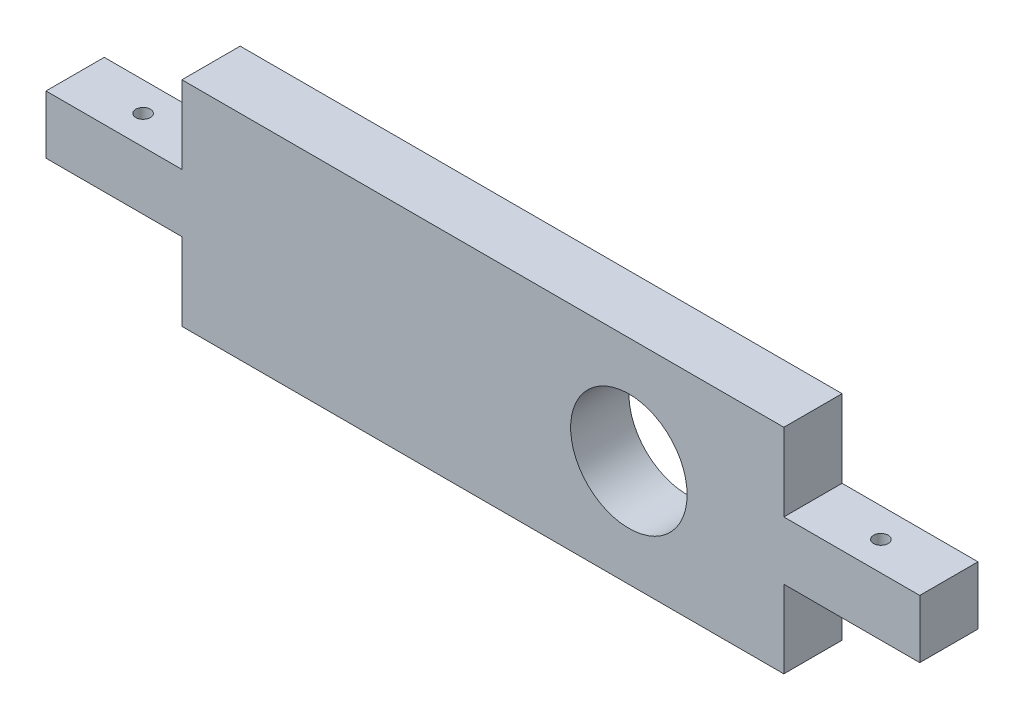
ISO-10303-21;
HEADER;
FILE_DESCRIPTION(('STEP AP214'),'2;1');
FILE_NAME('part.step','',(''),(''),'','','');
FILE_SCHEMA(('AUTOMOTIVE_DESIGN { 1 0 10303 214 1 1 1 1 }'));
ENDSEC;
DATA;
#1=APPLICATION_CONTEXT('core data for automotive mechanical design processes');
#2=APPLICATION_PROTOCOL_DEFINITION('international standard','automotive_design',2000,#1);
#3=PRODUCT_CONTEXT('',#1,'mechanical');
#4=PRODUCT('Part','Part','',(#3));
#5=PRODUCT_RELATED_PRODUCT_CATEGORY('part','',(#4));
#6=PRODUCT_DEFINITION_FORMATION('','',#4);
#7=PRODUCT_DEFINITION_CONTEXT('part definition',#1,'design');
#8=PRODUCT_DEFINITION('design','',#6,#7);
#9=PRODUCT_DEFINITION_SHAPE('','',#8);
#10=(LENGTH_UNIT() NAMED_UNIT(*) SI_UNIT(.MILLI.,.METRE.));
#11=(NAMED_UNIT(*) PLANE_ANGLE_UNIT() SI_UNIT($,.RADIAN.));
#12=(NAMED_UNIT(*) SI_UNIT($,.STERADIAN.) SOLID_ANGLE_UNIT());
#13=UNCERTAINTY_MEASURE_WITH_UNIT(LENGTH_MEASURE(1.E-05),#10,'distance_accuracy_value','');
#14=(GEOMETRIC_REPRESENTATION_CONTEXT(3) GLOBAL_UNCERTAINTY_ASSIGNED_CONTEXT((#13)) GLOBAL_UNIT_ASSIGNED_CONTEXT((#10,
#11,#12)) REPRESENTATION_CONTEXT('',''));
#15=CARTESIAN_POINT('',(0.,0.,0.));
#16=DIRECTION('',(0.,0.,1.));
#17=DIRECTION('',(1.,0.,0.));
#18=AXIS2_PLACEMENT_3D('',#15,#16,#17);
#19=CARTESIAN_POINT('',(0.,0.,38.1));
#20=DIRECTION('',(1.,0.,0.));
#21=DIRECTION('',(0.,1.,0.));
#22=AXIS2_PLACEMENT_3D('',#19,#20,#21);
#23=PLANE('',#22);
#24=DIRECTION('',(0.,-1.,0.));
#25=VECTOR('',#24,1.);
#26=CARTESIAN_POINT('',(0.,0.,0.));
#27=LINE('',#26,#25);
#28=CARTESIAN_POINT('',(0.,88.8999999999999,0.));
#29=VERTEX_POINT('',#28);
#30=CARTESIAN_POINT('',(0.,50.8,0.));
#31=VERTEX_POINT('',#30);
#32=EDGE_CURVE('E154',#29,#31,#27,.T.);
#33=ORIENTED_EDGE('',*,*,#32,.T.);
#34=DIRECTION('',(0.,0.,1.));
#35=VECTOR('',#34,1.);
#36=CARTESIAN_POINT('',(0.,50.8,0.));
#37=LINE('',#36,#35);
#38=CARTESIAN_POINT('',(0.,50.8,38.1));
#39=VERTEX_POINT('',#38);
#40=EDGE_CURVE('E138',#31,#39,#37,.T.);
#41=ORIENTED_EDGE('',*,*,#40,.T.);
#42=DIRECTION('',(0.,-1.,0.));
#43=VECTOR('',#42,1.);
#44=CARTESIAN_POINT('',(0.,0.,38.1));
#45=LINE('',#44,#43);
#46=CARTESIAN_POINT('',(0.,88.8999999999999,38.1));
#47=VERTEX_POINT('',#46);
#48=EDGE_CURVE('E174',#47,#39,#45,.T.);
#49=ORIENTED_EDGE('',*,*,#48,.F.);
#50=DIRECTION('',(0.,0.,1.));
#51=VECTOR('',#50,1.);
#52=CARTESIAN_POINT('',(0.,88.8999999999999,0.));
#53=LINE('',#52,#51);
#54=EDGE_CURVE('E159',#29,#47,#53,.T.);
#55=ORIENTED_EDGE('',*,*,#54,.F.);
#56=EDGE_LOOP('',(#33,#41,#49,#55));
#57=FACE_BOUND('',#56,.T.);
#58=ADVANCED_FACE('F50',(#57),#23,.F.);
#59=CARTESIAN_POINT('',(0.,0.,38.1));
#60=DIRECTION('',(0.,1.,0.));
#61=DIRECTION('',(0.,0.,1.));
#62=AXIS2_PLACEMENT_3D('',#59,#60,#61);
#63=PLANE('',#62);
#64=DIRECTION('',(1.,0.,0.));
#65=VECTOR('',#64,1.);
#66=CARTESIAN_POINT('',(0.,0.,38.1));
#67=LINE('',#66,#65);
#68=CARTESIAN_POINT('',(88.9,0.,38.1));
#69=VERTEX_POINT('',#68);
#70=CARTESIAN_POINT('',(482.6,0.,38.1));
#71=VERTEX_POINT('',#70);
#72=EDGE_CURVE('E179',#69,#71,#67,.T.);
#73=ORIENTED_EDGE('',*,*,#72,.F.);
#74=DIRECTION('',(0.,0.,1.));
#75=VECTOR('',#74,1.);
#76=CARTESIAN_POINT('',(88.9,0.,0.));
#77=LINE('',#76,#75);
#78=CARTESIAN_POINT('',(88.9,0.,0.));
#79=VERTEX_POINT('',#78);
#80=EDGE_CURVE('E146',#79,#69,#77,.T.);
#81=ORIENTED_EDGE('',*,*,#80,.F.);
#82=DIRECTION('',(1.,0.,0.));
#83=VECTOR('',#82,1.);
#84=CARTESIAN_POINT('',(0.,0.,0.));
#85=LINE('',#84,#83);
#86=CARTESIAN_POINT('',(482.6,0.,0.));
#87=VERTEX_POINT('',#86);
#88=EDGE_CURVE('E160',#79,#87,#85,.T.);
#89=ORIENTED_EDGE('',*,*,#88,.T.);
#90=DIRECTION('',(0.,0.,1.));
#91=VECTOR('',#90,1.);
#92=CARTESIAN_POINT('',(482.6,0.,0.));
#93=LINE('',#92,#91);
#94=EDGE_CURVE('E239',#87,#71,#93,.T.);
#95=ORIENTED_EDGE('',*,*,#94,.T.);
#96=EDGE_LOOP('',(#73,#81,#89,#95));
#97=FACE_BOUND('',#96,.T.);
#98=ADVANCED_FACE('F290',(#97),#63,.F.);
#99=CARTESIAN_POINT('',(571.5,0.,38.1));
#100=DIRECTION('',(-1.,0.,0.));
#101=DIRECTION('',(0.,0.,1.));
#102=AXIS2_PLACEMENT_3D('',#99,#100,#101);
#103=PLANE('',#102);
#104=DIRECTION('',(0.,1.,0.));
#105=VECTOR('',#104,1.);
#106=CARTESIAN_POINT('',(571.5,0.,38.1));
#107=LINE('',#106,#105);
#108=CARTESIAN_POINT('',(571.5,50.8000000000001,38.1));
#109=VERTEX_POINT('',#108);
#110=CARTESIAN_POINT('',(571.5,88.9000000000001,38.1));
#111=VERTEX_POINT('',#110);
#112=EDGE_CURVE('E58',#109,#111,#107,.T.);
#113=ORIENTED_EDGE('',*,*,#112,.F.);
#114=DIRECTION('',(0.,0.,1.));
#115=VECTOR('',#114,1.);
#116=CARTESIAN_POINT('',(571.5,50.8000000000001,0.));
#117=LINE('',#116,#115);
#118=CARTESIAN_POINT('',(571.5,50.8000000000001,0.));
#119=VERTEX_POINT('',#118);
#120=EDGE_CURVE('E237',#119,#109,#117,.T.);
#121=ORIENTED_EDGE('',*,*,#120,.F.);
#122=DIRECTION('',(0.,1.,0.));
#123=VECTOR('',#122,1.);
#124=CARTESIAN_POINT('',(571.5,0.,0.));
#125=LINE('',#124,#123);
#126=CARTESIAN_POINT('',(571.5,88.9000000000001,0.));
#127=VERTEX_POINT('',#126);
#128=EDGE_CURVE('E163',#119,#127,#125,.T.);
#129=ORIENTED_EDGE('',*,*,#128,.T.);
#130=DIRECTION('',(0.,0.,1.));
#131=VECTOR('',#130,1.);
#132=CARTESIAN_POINT('',(571.5,88.9000000000001,0.));
#133=LINE('',#132,#131);
#134=EDGE_CURVE('E198',#127,#111,#133,.T.);
#135=ORIENTED_EDGE('',*,*,#134,.T.);
#136=EDGE_LOOP('',(#113,#121,#129,#135));
#137=FACE_BOUND('',#136,.T.);
#138=ADVANCED_FACE('F206',(#137),#103,.F.);
#139=CARTESIAN_POINT('',(1.11022302462516E-13,139.7,38.1));
#140=DIRECTION('',(0.,-1.,0.));
#141=DIRECTION('',(0.,0.,-1.));
#142=AXIS2_PLACEMENT_3D('',#139,#140,#141);
#143=PLANE('',#142);
#144=DIRECTION('',(-1.,0.,0.));
#145=VECTOR('',#144,1.);
#146=CARTESIAN_POINT('',(1.11022302462516E-13,139.7,38.1));
#147=LINE('',#146,#145);
#148=CARTESIAN_POINT('',(482.6,139.7,38.1));
#149=VERTEX_POINT('',#148);
#150=CARTESIAN_POINT('',(88.9000000000001,139.7,38.1));
#151=VERTEX_POINT('',#150);
#152=EDGE_CURVE('E13',#149,#151,#147,.T.);
#153=ORIENTED_EDGE('',*,*,#152,.F.);
#154=DIRECTION('',(0.,0.,1.));
#155=VECTOR('',#154,1.);
#156=CARTESIAN_POINT('',(482.6,139.7,0.));
#157=LINE('',#156,#155);
#158=CARTESIAN_POINT('',(482.6,139.7,0.));
#159=VERTEX_POINT('',#158);
#160=EDGE_CURVE('E212',#159,#149,#157,.T.);
#161=ORIENTED_EDGE('',*,*,#160,.F.);
#162=DIRECTION('',(-1.,0.,0.));
#163=VECTOR('',#162,1.);
#164=CARTESIAN_POINT('',(1.11022302462516E-13,139.7,0.));
#165=LINE('',#164,#163);
#166=CARTESIAN_POINT('',(88.9000000000001,139.7,0.));
#167=VERTEX_POINT('',#166);
#168=EDGE_CURVE('E53',#159,#167,#165,.T.);
#169=ORIENTED_EDGE('',*,*,#168,.T.);
#170=DIRECTION('',(0.,0.,1.));
#171=VECTOR('',#170,1.);
#172=CARTESIAN_POINT('',(88.9000000000001,139.7,0.));
#173=LINE('',#172,#171);
#174=EDGE_CURVE('E161',#167,#151,#173,.T.);
#175=ORIENTED_EDGE('',*,*,#174,.T.);
#176=EDGE_LOOP('',(#153,#161,#169,#175));
#177=FACE_BOUND('',#176,.T.);
#178=ADVANCED_FACE('F231',(#177),#143,.F.);
#179=CARTESIAN_POINT('',(0.,0.,38.1));
#180=DIRECTION('',(0.,0.,-1.));
#181=DIRECTION('',(-1.,0.,0.));
#182=AXIS2_PLACEMENT_3D('',#179,#180,#181);
#183=PLANE('',#182);
#184=CARTESIAN_POINT('',(381.247583626148,69.8500000000001,38.1));
#185=DIRECTION('',(0.,0.,1.));
#186=DIRECTION('',(1.,0.,0.));
#187=AXIS2_PLACEMENT_3D('',#184,#185,#186);
#188=CIRCLE('',#187,38.1);
#189=CARTESIAN_POINT('',(419.347583626148,69.8500000000001,38.1));
#190=VERTEX_POINT('',#189);
#191=EDGE_CURVE('E262',#190,#190,#188,.T.);
#192=ORIENTED_EDGE('',*,*,#191,.F.);
#193=EDGE_LOOP('',(#192));
#194=FACE_BOUND('',#193,.T.);
#195=ORIENTED_EDGE('',*,*,#48,.T.);
#196=DIRECTION('',(-1.,0.,0.));
#197=VECTOR('',#196,1.);
#198=CARTESIAN_POINT('',(0.,50.8,38.1));
#199=LINE('',#198,#197);
#200=CARTESIAN_POINT('',(88.9000000000001,50.8,38.1));
#201=VERTEX_POINT('',#200);
#202=EDGE_CURVE('E141',#201,#39,#199,.T.);
#203=ORIENTED_EDGE('',*,*,#202,.F.);
#204=DIRECTION('',(0.,1.,0.));
#205=VECTOR('',#204,1.);
#206=CARTESIAN_POINT('',(88.9000000000001,50.8,38.1));
#207=LINE('',#206,#205);
#208=EDGE_CURVE('E156',#69,#201,#207,.T.);
#209=ORIENTED_EDGE('',*,*,#208,.F.);
#210=ORIENTED_EDGE('',*,*,#72,.T.);
#211=DIRECTION('',(0.,-1.,0.));
#212=VECTOR('',#211,1.);
#213=CARTESIAN_POINT('',(482.6,50.8,38.1));
#214=LINE('',#213,#212);
#215=CARTESIAN_POINT('',(482.6,50.8,38.1));
#216=VERTEX_POINT('',#215);
#217=EDGE_CURVE('E246',#216,#71,#214,.T.);
#218=ORIENTED_EDGE('',*,*,#217,.F.);
#219=DIRECTION('',(-1.,0.,0.));
#220=VECTOR('',#219,1.);
#221=CARTESIAN_POINT('',(571.5,50.8000000000001,38.1));
#222=LINE('',#221,#220);
#223=EDGE_CURVE('E195',#109,#216,#222,.T.);
#224=ORIENTED_EDGE('',*,*,#223,.F.);
#225=ORIENTED_EDGE('',*,*,#112,.T.);
#226=DIRECTION('',(1.,0.,0.));
#227=VECTOR('',#226,1.);
#228=CARTESIAN_POINT('',(571.5,88.9000000000001,38.1));
#229=LINE('',#228,#227);
#230=CARTESIAN_POINT('',(482.6,88.9,38.1));
#231=VERTEX_POINT('',#230);
#232=EDGE_CURVE('E192',#231,#111,#229,.T.);
#233=ORIENTED_EDGE('',*,*,#232,.F.);
#234=DIRECTION('',(0.,-1.,0.));
#235=VECTOR('',#234,1.);
#236=CARTESIAN_POINT('',(482.6,88.9,38.1));
#237=LINE('',#236,#235);
#238=EDGE_CURVE('E204',#149,#231,#237,.T.);
#239=ORIENTED_EDGE('',*,*,#238,.F.);
#240=ORIENTED_EDGE('',*,*,#152,.T.);
#241=DIRECTION('',(0.,1.,0.));
#242=VECTOR('',#241,1.);
#243=CARTESIAN_POINT('',(88.9000000000001,88.8999999999999,38.1));
#244=LINE('',#243,#242);
#245=CARTESIAN_POINT('',(88.9000000000001,88.8999999999999,38.1));
#246=VERTEX_POINT('',#245);
#247=EDGE_CURVE('E210',#246,#151,#244,.T.);
#248=ORIENTED_EDGE('',*,*,#247,.F.);
#249=DIRECTION('',(1.,0.,0.));
#250=VECTOR('',#249,1.);
#251=CARTESIAN_POINT('',(0.,88.8999999999999,38.1));
#252=LINE('',#251,#250);
#253=EDGE_CURVE('E207',#47,#246,#252,.T.);
#254=ORIENTED_EDGE('',*,*,#253,.F.);
#255=EDGE_LOOP('',(#195,#203,#209,#210,#218,#224,#225,#233,#239,#240,#248,#254));
#256=FACE_BOUND('',#255,.T.);
#257=ADVANCED_FACE('F190',(#194,#256),#183,.F.);
#258=CARTESIAN_POINT('',(0.,0.,0.));
#259=DIRECTION('',(0.,0.,-1.));
#260=DIRECTION('',(-1.,0.,0.));
#261=AXIS2_PLACEMENT_3D('',#258,#259,#260);
#262=PLANE('',#261);
#263=CARTESIAN_POINT('',(381.247583626148,69.8500000000001,0.));
#264=DIRECTION('',(0.,0.,1.));
#265=DIRECTION('',(1.,0.,0.));
#266=AXIS2_PLACEMENT_3D('',#263,#264,#265);
#267=CIRCLE('',#266,38.1);
#268=CARTESIAN_POINT('',(419.347583626148,69.8500000000001,0.));
#269=VERTEX_POINT('',#268);
#270=EDGE_CURVE('E260',#269,#269,#267,.T.);
#271=ORIENTED_EDGE('',*,*,#270,.T.);
#272=EDGE_LOOP('',(#271));
#273=FACE_BOUND('',#272,.T.);
#274=DIRECTION('',(-1.,0.,0.));
#275=VECTOR('',#274,1.);
#276=CARTESIAN_POINT('',(0.,50.8,0.));
#277=LINE('',#276,#275);
#278=CARTESIAN_POINT('',(88.9000000000001,50.8,0.));
#279=VERTEX_POINT('',#278);
#280=EDGE_CURVE('E66',#279,#31,#277,.T.);
#281=ORIENTED_EDGE('',*,*,#280,.T.);
#282=ORIENTED_EDGE('',*,*,#32,.F.);
#283=DIRECTION('',(1.,0.,0.));
#284=VECTOR('',#283,1.);
#285=CARTESIAN_POINT('',(0.,88.8999999999999,0.));
#286=LINE('',#285,#284);
#287=CARTESIAN_POINT('',(88.9000000000001,88.8999999999999,0.));
#288=VERTEX_POINT('',#287);
#289=EDGE_CURVE('E218',#29,#288,#286,.T.);
#290=ORIENTED_EDGE('',*,*,#289,.T.);
#291=DIRECTION('',(0.,1.,0.));
#292=VECTOR('',#291,1.);
#293=CARTESIAN_POINT('',(88.9000000000001,88.8999999999999,0.));
#294=LINE('',#293,#292);
#295=EDGE_CURVE('E220',#288,#167,#294,.T.);
#296=ORIENTED_EDGE('',*,*,#295,.T.);
#297=ORIENTED_EDGE('',*,*,#168,.F.);
#298=DIRECTION('',(0.,-1.,0.));
#299=VECTOR('',#298,1.);
#300=CARTESIAN_POINT('',(482.6,88.9,0.));
#301=LINE('',#300,#299);
#302=CARTESIAN_POINT('',(482.6,88.9,0.));
#303=VERTEX_POINT('',#302);
#304=EDGE_CURVE('E203',#159,#303,#301,.T.);
#305=ORIENTED_EDGE('',*,*,#304,.T.);
#306=DIRECTION('',(1.,0.,0.));
#307=VECTOR('',#306,1.);
#308=CARTESIAN_POINT('',(571.5,88.9000000000001,0.));
#309=LINE('',#308,#307);
#310=EDGE_CURVE('E217',#303,#127,#309,.T.);
#311=ORIENTED_EDGE('',*,*,#310,.T.);
#312=ORIENTED_EDGE('',*,*,#128,.F.);
#313=DIRECTION('',(-1.,0.,0.));
#314=VECTOR('',#313,1.);
#315=CARTESIAN_POINT('',(571.5,50.8000000000001,0.));
#316=LINE('',#315,#314);
#317=CARTESIAN_POINT('',(482.6,50.8,0.));
#318=VERTEX_POINT('',#317);
#319=EDGE_CURVE('E249',#119,#318,#316,.T.);
#320=ORIENTED_EDGE('',*,*,#319,.T.);
#321=DIRECTION('',(0.,-1.,0.));
#322=VECTOR('',#321,1.);
#323=CARTESIAN_POINT('',(482.6,50.8,0.));
#324=LINE('',#323,#322);
#325=EDGE_CURVE('E74',#318,#87,#324,.T.);
#326=ORIENTED_EDGE('',*,*,#325,.T.);
#327=ORIENTED_EDGE('',*,*,#88,.F.);
#328=DIRECTION('',(0.,1.,0.));
#329=VECTOR('',#328,1.);
#330=CARTESIAN_POINT('',(88.9000000000001,50.8,0.));
#331=LINE('',#330,#329);
#332=EDGE_CURVE('E147',#79,#279,#331,.T.);
#333=ORIENTED_EDGE('',*,*,#332,.T.);
#334=EDGE_LOOP('',(#281,#282,#290,#296,#297,#305,#311,#312,#320,#326,#327,#333));
#335=FACE_BOUND('',#334,.T.);
#336=ADVANCED_FACE('F152',(#273,#335),#262,.T.);
#337=CARTESIAN_POINT('',(88.9000000000001,88.8999999999999,0.));
#338=DIRECTION('',(1.,0.,0.));
#339=DIRECTION('',(0.,0.,-1.));
#340=AXIS2_PLACEMENT_3D('',#337,#338,#339);
#341=PLANE('',#340);
#342=ORIENTED_EDGE('',*,*,#247,.T.);
#343=ORIENTED_EDGE('',*,*,#174,.F.);
#344=ORIENTED_EDGE('',*,*,#295,.F.);
#345=DIRECTION('',(0.,0.,1.));
#346=VECTOR('',#345,1.);
#347=CARTESIAN_POINT('',(88.9000000000001,88.8999999999999,0.));
#348=LINE('',#347,#346);
#349=EDGE_CURVE('E166',#288,#246,#348,.T.);
#350=ORIENTED_EDGE('',*,*,#349,.T.);
#351=EDGE_LOOP('',(#342,#343,#344,#350));
#352=FACE_BOUND('',#351,.T.);
#353=ADVANCED_FACE('F230',(#352),#341,.F.);
#354=CARTESIAN_POINT('',(0.,88.8999999999999,0.));
#355=DIRECTION('',(0.,-1.,0.));
#356=DIRECTION('',(0.,0.,-1.));
#357=AXIS2_PLACEMENT_3D('',#354,#355,#356);
#358=PLANE('',#357);
#359=CARTESIAN_POINT('',(44.45,88.8999999999999,19.05));
#360=DIRECTION('',(0.,-1.,0.));
#361=DIRECTION('',(0.,0.,-1.));
#362=AXIS2_PLACEMENT_3D('',#359,#360,#361);
#363=CIRCLE('',#362,4.7625);
#364=CARTESIAN_POINT('',(49.2125,88.8999999999999,19.05));
#365=VERTEX_POINT('',#364);
#366=EDGE_CURVE('E265',#365,#365,#363,.T.);
#367=ORIENTED_EDGE('',*,*,#366,.T.);
#368=EDGE_LOOP('',(#367));
#369=FACE_BOUND('',#368,.T.);
#370=ORIENTED_EDGE('',*,*,#253,.T.);
#371=ORIENTED_EDGE('',*,*,#349,.F.);
#372=ORIENTED_EDGE('',*,*,#289,.F.);
#373=ORIENTED_EDGE('',*,*,#54,.T.);
#374=EDGE_LOOP('',(#370,#371,#372,#373));
#375=FACE_BOUND('',#374,.T.);
#376=ADVANCED_FACE('F227',(#369,#375),#358,.F.);
#377=CARTESIAN_POINT('',(571.5,88.9000000000001,0.));
#378=DIRECTION('',(0.,-1.,0.));
#379=DIRECTION('',(1.,0.,0.));
#380=AXIS2_PLACEMENT_3D('',#377,#378,#379);
#381=PLANE('',#380);
#382=CARTESIAN_POINT('',(527.05,88.9,19.05));
#383=DIRECTION('',(0.,-1.,0.));
#384=DIRECTION('',(1.,0.,0.));
#385=AXIS2_PLACEMENT_3D('',#382,#383,#384);
#386=CIRCLE('',#385,4.76250000000001);
#387=CARTESIAN_POINT('',(531.8125,88.9,19.05));
#388=VERTEX_POINT('',#387);
#389=EDGE_CURVE('E273',#388,#388,#386,.T.);
#390=ORIENTED_EDGE('',*,*,#389,.T.);
#391=EDGE_LOOP('',(#390));
#392=FACE_BOUND('',#391,.T.);
#393=ORIENTED_EDGE('',*,*,#232,.T.);
#394=ORIENTED_EDGE('',*,*,#134,.F.);
#395=ORIENTED_EDGE('',*,*,#310,.F.);
#396=DIRECTION('',(0.,0.,1.));
#397=VECTOR('',#396,1.);
#398=CARTESIAN_POINT('',(482.6,88.9,0.));
#399=LINE('',#398,#397);
#400=EDGE_CURVE('E201',#303,#231,#399,.T.);
#401=ORIENTED_EDGE('',*,*,#400,.T.);
#402=EDGE_LOOP('',(#393,#394,#395,#401));
#403=FACE_BOUND('',#402,.T.);
#404=ADVANCED_FACE('F197',(#392,#403),#381,.F.);
#405=CARTESIAN_POINT('',(482.6,88.9,0.));
#406=DIRECTION('',(-1.,0.,0.));
#407=DIRECTION('',(0.,0.,1.));
#408=AXIS2_PLACEMENT_3D('',#405,#406,#407);
#409=PLANE('',#408);
#410=ORIENTED_EDGE('',*,*,#238,.T.);
#411=ORIENTED_EDGE('',*,*,#400,.F.);
#412=ORIENTED_EDGE('',*,*,#304,.F.);
#413=ORIENTED_EDGE('',*,*,#160,.T.);
#414=EDGE_LOOP('',(#410,#411,#412,#413));
#415=FACE_BOUND('',#414,.T.);
#416=ADVANCED_FACE('F327',(#415),#409,.F.);
#417=CARTESIAN_POINT('',(482.6,50.8,0.));
#418=DIRECTION('',(-1.,0.,0.));
#419=DIRECTION('',(0.,0.,1.));
#420=AXIS2_PLACEMENT_3D('',#417,#418,#419);
#421=PLANE('',#420);
#422=ORIENTED_EDGE('',*,*,#217,.T.);
#423=ORIENTED_EDGE('',*,*,#94,.F.);
#424=ORIENTED_EDGE('',*,*,#325,.F.);
#425=DIRECTION('',(0.,0.,1.));
#426=VECTOR('',#425,1.);
#427=CARTESIAN_POINT('',(482.6,50.8,0.));
#428=LINE('',#427,#426);
#429=EDGE_CURVE('E241',#318,#216,#428,.T.);
#430=ORIENTED_EDGE('',*,*,#429,.T.);
#431=EDGE_LOOP('',(#422,#423,#424,#430));
#432=FACE_BOUND('',#431,.T.);
#433=ADVANCED_FACE('F286',(#432),#421,.F.);
#434=CARTESIAN_POINT('',(571.5,50.8000000000001,0.));
#435=DIRECTION('',(0.,1.,0.));
#436=DIRECTION('',(-1.,0.,0.));
#437=AXIS2_PLACEMENT_3D('',#434,#435,#436);
#438=PLANE('',#437);
#439=CARTESIAN_POINT('',(527.05,50.7999999999998,19.05));
#440=DIRECTION('',(0.,-1.,0.));
#441=DIRECTION('',(1.,0.,0.));
#442=AXIS2_PLACEMENT_3D('',#439,#440,#441);
#443=CIRCLE('',#442,4.76250000000001);
#444=CARTESIAN_POINT('',(531.8125,50.7999999999998,19.05));
#445=VERTEX_POINT('',#444);
#446=EDGE_CURVE('E276',#445,#445,#443,.T.);
#447=ORIENTED_EDGE('',*,*,#446,.F.);
#448=EDGE_LOOP('',(#447));
#449=FACE_BOUND('',#448,.T.);
#450=ORIENTED_EDGE('',*,*,#223,.T.);
#451=ORIENTED_EDGE('',*,*,#429,.F.);
#452=ORIENTED_EDGE('',*,*,#319,.F.);
#453=ORIENTED_EDGE('',*,*,#120,.T.);
#454=EDGE_LOOP('',(#450,#451,#452,#453));
#455=FACE_BOUND('',#454,.T.);
#456=ADVANCED_FACE('F283',(#449,#455),#438,.F.);
#457=CARTESIAN_POINT('',(0.,50.8,0.));
#458=DIRECTION('',(0.,1.,0.));
#459=DIRECTION('',(-1.,0.,0.));
#460=AXIS2_PLACEMENT_3D('',#457,#458,#459);
#461=PLANE('',#460);
#462=CARTESIAN_POINT('',(44.45,50.8,19.05));
#463=DIRECTION('',(0.,-1.,0.));
#464=DIRECTION('',(1.,0.,0.));
#465=AXIS2_PLACEMENT_3D('',#462,#463,#464);
#466=CIRCLE('',#465,4.7625);
#467=CARTESIAN_POINT('',(49.2125,50.8,19.05));
#468=VERTEX_POINT('',#467);
#469=EDGE_CURVE('E270',#468,#468,#466,.T.);
#470=ORIENTED_EDGE('',*,*,#469,.F.);
#471=EDGE_LOOP('',(#470));
#472=FACE_BOUND('',#471,.T.);
#473=ORIENTED_EDGE('',*,*,#202,.T.);
#474=ORIENTED_EDGE('',*,*,#40,.F.);
#475=ORIENTED_EDGE('',*,*,#280,.F.);
#476=DIRECTION('',(0.,0.,1.));
#477=VECTOR('',#476,1.);
#478=CARTESIAN_POINT('',(88.9000000000001,50.8,0.));
#479=LINE('',#478,#477);
#480=EDGE_CURVE('E251',#279,#201,#479,.T.);
#481=ORIENTED_EDGE('',*,*,#480,.T.);
#482=EDGE_LOOP('',(#473,#474,#475,#481));
#483=FACE_BOUND('',#482,.T.);
#484=ADVANCED_FACE('F139',(#472,#483),#461,.F.);
#485=CARTESIAN_POINT('',(88.9000000000001,50.8,0.));
#486=DIRECTION('',(1.,0.,0.));
#487=DIRECTION('',(0.,1.,0.));
#488=AXIS2_PLACEMENT_3D('',#485,#486,#487);
#489=PLANE('',#488);
#490=ORIENTED_EDGE('',*,*,#208,.T.);
#491=ORIENTED_EDGE('',*,*,#480,.F.);
#492=ORIENTED_EDGE('',*,*,#332,.F.);
#493=ORIENTED_EDGE('',*,*,#80,.T.);
#494=EDGE_LOOP('',(#490,#491,#492,#493));
#495=FACE_BOUND('',#494,.T.);
#496=ADVANCED_FACE('F292',(#495),#489,.F.);
#497=CARTESIAN_POINT('',(381.247583626148,69.8500000000001,0.));
#498=DIRECTION('',(0.,0.,1.));
#499=DIRECTION('',(1.,0.,0.));
#500=AXIS2_PLACEMENT_3D('',#497,#498,#499);
#501=CYLINDRICAL_SURFACE('',#500,38.1);
#502=CARTESIAN_POINT('',(419.347583626148,69.8500000000001,0.));
#503=CARTESIAN_POINT('',(419.347583626148,69.8500000000001,0.396875));
#504=CARTESIAN_POINT('',(419.347583626148,69.8500000000001,0.79375));
#505=CARTESIAN_POINT('',(419.347583626148,69.8500000000001,1.5875));
#506=CARTESIAN_POINT('',(419.347583626148,69.8500000000001,1.984375));
#507=CARTESIAN_POINT('',(419.347583626148,69.8500000000001,2.778125));
#508=CARTESIAN_POINT('',(419.347583626148,69.8500000000001,3.175));
#509=CARTESIAN_POINT('',(419.347583626148,69.8500000000001,3.96875));
#510=CARTESIAN_POINT('',(419.347583626148,69.8500000000001,4.365625));
#511=CARTESIAN_POINT('',(419.347583626148,69.8500000000001,5.159375));
#512=CARTESIAN_POINT('',(419.347583626148,69.8500000000001,5.55625));
#513=CARTESIAN_POINT('',(419.347583626148,69.8500000000001,6.35));
#514=CARTESIAN_POINT('',(419.347583626148,69.8500000000001,6.746875));
#515=CARTESIAN_POINT('',(419.347583626148,69.8500000000001,7.540625));
#516=CARTESIAN_POINT('',(419.347583626148,69.8500000000001,7.9375));
#517=CARTESIAN_POINT('',(419.347583626148,69.8500000000001,8.73125));
#518=CARTESIAN_POINT('',(419.347583626148,69.8500000000001,9.128125));
#519=CARTESIAN_POINT('',(419.347583626148,69.8500000000001,9.921875));
#520=CARTESIAN_POINT('',(419.347583626148,69.8500000000001,10.31875));
#521=CARTESIAN_POINT('',(419.347583626148,69.8500000000001,11.1125));
#522=CARTESIAN_POINT('',(419.347583626148,69.8500000000001,11.509375));
#523=CARTESIAN_POINT('',(419.347583626148,69.8500000000001,12.303125));
#524=CARTESIAN_POINT('',(419.347583626148,69.8500000000001,12.7));
#525=CARTESIAN_POINT('',(419.347583626148,69.8500000000001,13.49375));
#526=CARTESIAN_POINT('',(419.347583626148,69.8500000000001,13.890625));
#527=CARTESIAN_POINT('',(419.347583626148,69.8500000000001,14.684375));
#528=CARTESIAN_POINT('',(419.347583626148,69.8500000000001,15.08125));
#529=CARTESIAN_POINT('',(419.347583626148,69.8500000000001,15.875));
#530=CARTESIAN_POINT('',(419.347583626148,69.8500000000001,16.271875));
#531=CARTESIAN_POINT('',(419.347583626148,69.8500000000001,17.065625));
#532=CARTESIAN_POINT('',(419.347583626148,69.8500000000001,17.4625));
#533=CARTESIAN_POINT('',(419.347583626148,69.8500000000001,18.25625));
#534=CARTESIAN_POINT('',(419.347583626148,69.8500000000001,18.653125));
#535=CARTESIAN_POINT('',(419.347583626148,69.8500000000001,19.446875));
#536=CARTESIAN_POINT('',(419.347583626148,69.8500000000001,19.84375));
#537=CARTESIAN_POINT('',(419.347583626148,69.8500000000001,20.6375));
#538=CARTESIAN_POINT('',(419.347583626148,69.8500000000001,21.034375));
#539=CARTESIAN_POINT('',(419.347583626148,69.8500000000001,21.828125));
#540=CARTESIAN_POINT('',(419.347583626148,69.8500000000001,22.225));
#541=CARTESIAN_POINT('',(419.347583626148,69.8500000000001,23.01875));
#542=CARTESIAN_POINT('',(419.347583626148,69.8500000000001,23.415625));
#543=CARTESIAN_POINT('',(419.347583626148,69.8500000000001,24.209375));
#544=CARTESIAN_POINT('',(419.347583626148,69.8500000000001,24.60625));
#545=CARTESIAN_POINT('',(419.347583626148,69.8500000000001,25.4));
#546=CARTESIAN_POINT('',(419.347583626148,69.8500000000001,25.796875));
#547=CARTESIAN_POINT('',(419.347583626148,69.8500000000001,26.590625));
#548=CARTESIAN_POINT('',(419.347583626148,69.8500000000001,26.9875));
#549=CARTESIAN_POINT('',(419.347583626148,69.8500000000001,27.78125));
#550=CARTESIAN_POINT('',(419.347583626148,69.8500000000001,28.178125));
#551=CARTESIAN_POINT('',(419.347583626148,69.8500000000001,28.971875));
#552=CARTESIAN_POINT('',(419.347583626148,69.8500000000001,29.36875));
#553=CARTESIAN_POINT('',(419.347583626148,69.8500000000001,30.1625));
#554=CARTESIAN_POINT('',(419.347583626148,69.8500000000001,30.559375));
#555=CARTESIAN_POINT('',(419.347583626148,69.8500000000001,31.353125));
#556=CARTESIAN_POINT('',(419.347583626148,69.8500000000001,31.75));
#557=CARTESIAN_POINT('',(419.347583626148,69.8500000000001,32.54375));
#558=CARTESIAN_POINT('',(419.347583626148,69.8500000000001,32.940625));
#559=CARTESIAN_POINT('',(419.347583626148,69.8500000000001,33.734375));
#560=CARTESIAN_POINT('',(419.347583626148,69.8500000000001,34.13125));
#561=CARTESIAN_POINT('',(419.347583626148,69.8500000000001,34.925));
#562=CARTESIAN_POINT('',(419.347583626148,69.8500000000001,35.321875));
#563=CARTESIAN_POINT('',(419.347583626148,69.8500000000001,36.115625));
#564=CARTESIAN_POINT('',(419.347583626148,69.8500000000001,36.5125));
#565=CARTESIAN_POINT('',(419.347583626148,69.8500000000001,37.30625));
#566=CARTESIAN_POINT('',(419.347583626148,69.8500000000001,37.703125));
#567=CARTESIAN_POINT('',(419.347583626148,69.8500000000001,38.1));
#568=B_SPLINE_CURVE_WITH_KNOTS('',3,(#502,#503,#504,#505,#506,#507,#508,#509,#510,#511,#512,
#513,#514,#515,#516,#517,#518,#519,#520,#521,#522,#523,#524,#525,#526,#527,#528,#529,#530,#531,
#532,#533,#534,#535,#536,#537,#538,#539,#540,#541,#542,#543,#544,#545,#546,#547,#548,#549,#550,
#551,#552,#553,#554,#555,#556,#557,#558,#559,#560,#561,#562,#563,#564,#565,#566,#567),
.UNSPECIFIED.,.F.,.F.,(4,2,2,2,2,2,2,2,2,2,2,2,2,2,2,2,2,2,2,2,2,2,2,2,2,2,2,2,2,2,2,2,4),(0.,
1.190625,2.38125,3.571875,4.7625,5.953125,7.14375,8.334375,9.525,10.715625,11.90625,13.096875,
14.2875,15.478125,16.66875,17.859375,19.05,20.240625,21.43125,22.621875,23.8125,25.003125,
26.19375,27.384375,28.575,29.765625,30.95625,32.146875,33.3375,34.528125,35.71875,36.909375,
38.1),.UNSPECIFIED.);
#569=EDGE_CURVE('BSEAM294',#269,#190,#568,.T.);
#570=ORIENTED_EDGE('',*,*,#270,.F.);
#571=ORIENTED_EDGE('',*,*,#191,.T.);
#572=ORIENTED_EDGE('',*,*,#569,.T.);
#573=ORIENTED_EDGE('',*,*,#569,.F.);
#574=EDGE_LOOP('',(#570,#572,#571,#573));
#575=FACE_BOUND('',#574,.T.);
#576=ADVANCED_FACE('F294',(#575),#501,.F.);
#577=CARTESIAN_POINT('',(44.4499999999999,139.7,19.05));
#578=DIRECTION('',(0.,-1.,0.));
#579=DIRECTION('',(1.,0.,0.));
#580=AXIS2_PLACEMENT_3D('',#577,#578,#579);
#581=CYLINDRICAL_SURFACE('',#580,4.7625);
#582=CARTESIAN_POINT('',(49.2125,50.8,19.05));
#583=CARTESIAN_POINT('',(49.2125,51.196875,19.05));
#584=CARTESIAN_POINT('',(49.2125,51.59375,19.05));
#585=CARTESIAN_POINT('',(49.2125,52.3875,19.05));
#586=CARTESIAN_POINT('',(49.2125,52.784375,19.05));
#587=CARTESIAN_POINT('',(49.2125,53.578125,19.05));
#588=CARTESIAN_POINT('',(49.2125,53.975,19.05));
#589=CARTESIAN_POINT('',(49.2125,54.76875,19.05));
#590=CARTESIAN_POINT('',(49.2125,55.165625,19.05));
#591=CARTESIAN_POINT('',(49.2125,55.959375,19.05));
#592=CARTESIAN_POINT('',(49.2125,56.35625,19.05));
#593=CARTESIAN_POINT('',(49.2125,57.15,19.05));
#594=CARTESIAN_POINT('',(49.2125,57.546875,19.05));
#595=CARTESIAN_POINT('',(49.2125,58.340625,19.05));
#596=CARTESIAN_POINT('',(49.2125,58.7375,19.05));
#597=CARTESIAN_POINT('',(49.2125,59.53125,19.05));
#598=CARTESIAN_POINT('',(49.2125,59.928125,19.05));
#599=CARTESIAN_POINT('',(49.2125,60.721875,19.05));
#600=CARTESIAN_POINT('',(49.2125,61.11875,19.05));
#601=CARTESIAN_POINT('',(49.2125,61.9125,19.05));
#602=CARTESIAN_POINT('',(49.2125,62.309375,19.05));
#603=CARTESIAN_POINT('',(49.2125,63.103125,19.05));
#604=CARTESIAN_POINT('',(49.2125,63.5,19.05));
#605=CARTESIAN_POINT('',(49.2125,64.29375,19.05));
#606=CARTESIAN_POINT('',(49.2125,64.690625,19.05));
#607=CARTESIAN_POINT('',(49.2125,65.484375,19.05));
#608=CARTESIAN_POINT('',(49.2125,65.88125,19.05));
#609=CARTESIAN_POINT('',(49.2125,66.675,19.05));
#610=CARTESIAN_POINT('',(49.2125,67.071875,19.05));
#611=CARTESIAN_POINT('',(49.2125,67.865625,19.05));
#612=CARTESIAN_POINT('',(49.2125,68.2624999999999,19.05));
#613=CARTESIAN_POINT('',(49.2125,69.05625,19.05));
#614=CARTESIAN_POINT('',(49.2125,69.4531249999999,19.05));
#615=CARTESIAN_POINT('',(49.2125,70.246875,19.05));
#616=CARTESIAN_POINT('',(49.2125,70.64375,19.05));
#617=CARTESIAN_POINT('',(49.2125,71.4375,19.05));
#618=CARTESIAN_POINT('',(49.2125,71.834375,19.05));
#619=CARTESIAN_POINT('',(49.2125,72.6281249999999,19.05));
#620=CARTESIAN_POINT('',(49.2125,73.0249999999999,19.05));
#621=CARTESIAN_POINT('',(49.2125,73.81875,19.05));
#622=CARTESIAN_POINT('',(49.2125,74.2156249999999,19.05));
#623=CARTESIAN_POINT('',(49.2125,75.0093749999999,19.05));
#624=CARTESIAN_POINT('',(49.2125,75.4062499999999,19.05));
#625=CARTESIAN_POINT('',(49.2125,76.1999999999999,19.05));
#626=CARTESIAN_POINT('',(49.2125,76.5968749999999,19.05));
#627=CARTESIAN_POINT('',(49.2125,77.3906249999999,19.05));
#628=CARTESIAN_POINT('',(49.2125,77.7874999999999,19.05));
#629=CARTESIAN_POINT('',(49.2125,78.5812499999999,19.05));
#630=CARTESIAN_POINT('',(49.2125,78.9781249999999,19.05));
#631=CARTESIAN_POINT('',(49.2125,79.7718749999999,19.05));
#632=CARTESIAN_POINT('',(49.2125,80.1687499999999,19.05));
#633=CARTESIAN_POINT('',(49.2125,80.9624999999999,19.05));
#634=CARTESIAN_POINT('',(49.2125,81.3593749999999,19.05));
#635=CARTESIAN_POINT('',(49.2125,82.1531249999999,19.05));
#636=CARTESIAN_POINT('',(49.2125,82.5499999999999,19.05));
#637=CARTESIAN_POINT('',(49.2125,83.3437499999999,19.05));
#638=CARTESIAN_POINT('',(49.2125,83.7406249999999,19.05));
#639=CARTESIAN_POINT('',(49.2125,84.5343749999999,19.05));
#640=CARTESIAN_POINT('',(49.2125,84.9312499999999,19.05));
#641=CARTESIAN_POINT('',(49.2125,85.7249999999999,19.05));
#642=CARTESIAN_POINT('',(49.2125,86.1218749999999,19.05));
#643=CARTESIAN_POINT('',(49.2125,86.9156249999999,19.05));
#644=CARTESIAN_POINT('',(49.2125,87.3124999999999,19.05));
#645=CARTESIAN_POINT('',(49.2125,88.1062499999999,19.05));
#646=CARTESIAN_POINT('',(49.2125,88.5031249999999,19.05));
#647=CARTESIAN_POINT('',(49.2125,88.8999999999999,19.05));
#648=B_SPLINE_CURVE_WITH_KNOTS('',3,(#582,#583,#584,#585,#586,#587,#588,#589,#590,#591,#592,
#593,#594,#595,#596,#597,#598,#599,#600,#601,#602,#603,#604,#605,#606,#607,#608,#609,#610,#611,
#612,#613,#614,#615,#616,#617,#618,#619,#620,#621,#622,#623,#624,#625,#626,#627,#628,#629,#630,
#631,#632,#633,#634,#635,#636,#637,#638,#639,#640,#641,#642,#643,#644,#645,#646,#647),
.UNSPECIFIED.,.F.,.F.,(4,2,2,2,2,2,2,2,2,2,2,2,2,2,2,2,2,2,2,2,2,2,2,2,2,2,2,2,2,2,2,2,4),(0.,
1.190625,2.38125,3.57187499999999,4.76249999999999,5.95312499999999,7.14374999999998,
8.33437499999998,9.52499999999998,10.715625,11.90625,13.096875,14.2875,15.478125,16.66875,
17.859375,19.05,20.240625,21.43125,22.6218749999999,23.8124999999999,25.0031249999999,
26.1937499999999,27.3843749999999,28.5749999999999,29.7656249999999,30.9562499999999,
32.1468749999999,33.3374999999999,34.5281249999999,35.7187499999999,36.9093749999999,
38.0999999999999),.UNSPECIFIED.);
#649=EDGE_CURVE('BSEAM300',#468,#365,#648,.T.);
#650=ORIENTED_EDGE('',*,*,#469,.T.);
#651=ORIENTED_EDGE('',*,*,#366,.F.);
#652=ORIENTED_EDGE('',*,*,#649,.T.);
#653=ORIENTED_EDGE('',*,*,#649,.F.);
#654=EDGE_LOOP('',(#650,#652,#651,#653));
#655=FACE_BOUND('',#654,.T.);
#656=ADVANCED_FACE('F300',(#655),#581,.F.);
#657=CARTESIAN_POINT('',(527.05,139.7,19.05));
#658=DIRECTION('',(0.,-1.,0.));
#659=DIRECTION('',(1.,0.,0.));
#660=AXIS2_PLACEMENT_3D('',#657,#658,#659);
#661=CYLINDRICAL_SURFACE('',#660,4.76250000000001);
#662=ORIENTED_EDGE('',*,*,#446,.T.);
#663=EDGE_LOOP('',(#662));
#664=FACE_BOUND('',#663,.T.);
#665=ORIENTED_EDGE('',*,*,#389,.F.);
#666=EDGE_LOOP('',(#665));
#667=FACE_BOUND('',#666,.T.);
#668=ADVANCED_FACE('F280',(#664,#667),#661,.F.);
#669=CLOSED_SHELL('',(#58,#98,#138,#178,#257,#336,#353,#376,#404,#416,#433,#456,#484,#496,#576,
#656,#668));
#670=MANIFOLD_SOLID_BREP('B2',#669);
#671=ADVANCED_BREP_SHAPE_REPRESENTATION('',(#18,#670),#14);
#672=SHAPE_DEFINITION_REPRESENTATION(#9,#671);
ENDSEC;
END-ISO-10303-21;
